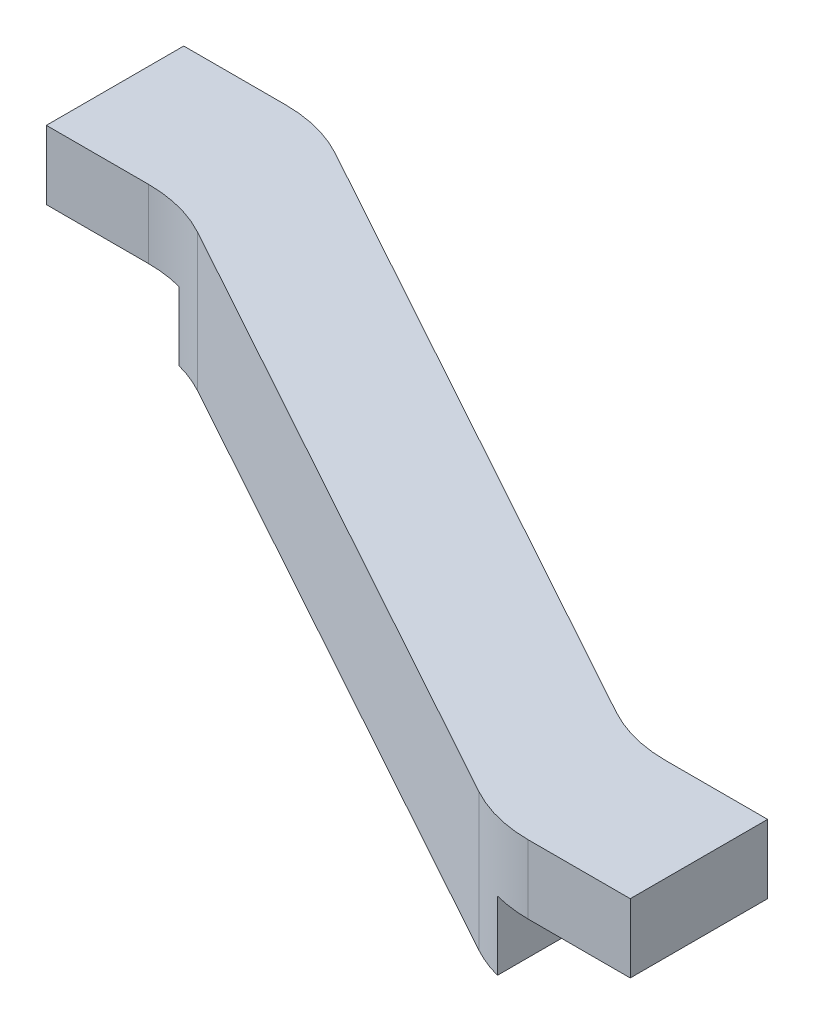
ISO-10303-21;
HEADER;
FILE_DESCRIPTION(('STEP AP214'),'2;1');
FILE_NAME('part.step','',(''),(''),'','','');
FILE_SCHEMA(('AUTOMOTIVE_DESIGN { 1 0 10303 214 1 1 1 1 }'));
ENDSEC;
DATA;
#1=APPLICATION_CONTEXT('core data for automotive mechanical design processes');
#2=APPLICATION_PROTOCOL_DEFINITION('international standard','automotive_design',2000,#1);
#3=PRODUCT_CONTEXT('',#1,'mechanical');
#4=PRODUCT('Part','Part','',(#3));
#5=PRODUCT_RELATED_PRODUCT_CATEGORY('part','',(#4));
#6=PRODUCT_DEFINITION_FORMATION('','',#4);
#7=PRODUCT_DEFINITION_CONTEXT('part definition',#1,'design');
#8=PRODUCT_DEFINITION('design','',#6,#7);
#9=PRODUCT_DEFINITION_SHAPE('','',#8);
#10=(LENGTH_UNIT() NAMED_UNIT(*) SI_UNIT(.MILLI.,.METRE.));
#11=(NAMED_UNIT(*) PLANE_ANGLE_UNIT() SI_UNIT($,.RADIAN.));
#12=(NAMED_UNIT(*) SI_UNIT($,.STERADIAN.) SOLID_ANGLE_UNIT());
#13=UNCERTAINTY_MEASURE_WITH_UNIT(LENGTH_MEASURE(1.E-05),#10,'distance_accuracy_value','');
#14=(GEOMETRIC_REPRESENTATION_CONTEXT(3) GLOBAL_UNCERTAINTY_ASSIGNED_CONTEXT((#13)) GLOBAL_UNIT_ASSIGNED_CONTEXT((#10,
#11,#12)) REPRESENTATION_CONTEXT('',''));
#15=CARTESIAN_POINT('',(0.,0.,0.));
#16=DIRECTION('',(0.,0.,1.));
#17=DIRECTION('',(1.,0.,0.));
#18=AXIS2_PLACEMENT_3D('',#15,#16,#17);
#19=CARTESIAN_POINT('',(-70.,20.,20.));
#20=DIRECTION('',(1.,0.,0.));
#21=DIRECTION('',(0.,0.,-1.));
#22=AXIS2_PLACEMENT_3D('',#19,#20,#21);
#23=PLANE('',#22);
#24=DIRECTION('',(0.,0.,1.));
#25=VECTOR('',#24,1.);
#26=CARTESIAN_POINT('',(-70.,10.,22.7368656040173));
#27=LINE('',#26,#25);
#28=CARTESIAN_POINT('',(-70.,10.,0.));
#29=VERTEX_POINT('',#28);
#30=CARTESIAN_POINT('',(-70.,10.,20.));
#31=VERTEX_POINT('',#30);
#32=EDGE_CURVE('E149',#29,#31,#27,.T.);
#33=ORIENTED_EDGE('',*,*,#32,.T.);
#34=DIRECTION('',(0.,-1.,0.));
#35=VECTOR('',#34,1.);
#36=CARTESIAN_POINT('',(-70.,20.,20.));
#37=LINE('',#36,#35);
#38=CARTESIAN_POINT('',(-70.,20.,20.));
#39=VERTEX_POINT('',#38);
#40=EDGE_CURVE('E188',#39,#31,#37,.T.);
#41=ORIENTED_EDGE('',*,*,#40,.F.);
#42=DIRECTION('',(0.,0.,1.));
#43=VECTOR('',#42,1.);
#44=CARTESIAN_POINT('',(-70.,20.,20.));
#45=LINE('',#44,#43);
#46=CARTESIAN_POINT('',(-70.,20.,0.));
#47=VERTEX_POINT('',#46);
#48=EDGE_CURVE('E173',#47,#39,#45,.T.);
#49=ORIENTED_EDGE('',*,*,#48,.F.);
#50=DIRECTION('',(0.,-1.,0.));
#51=VECTOR('',#50,1.);
#52=CARTESIAN_POINT('',(-70.,20.,0.));
#53=LINE('',#52,#51);
#54=EDGE_CURVE('E167',#47,#29,#53,.T.);
#55=ORIENTED_EDGE('',*,*,#54,.T.);
#56=EDGE_LOOP('',(#33,#41,#49,#55));
#57=FACE_BOUND('',#56,.T.);
#58=ADVANCED_FACE('F39',(#57),#23,.F.);
#59=CARTESIAN_POINT('',(-50.,20.,20.));
#60=DIRECTION('',(0.,0.,-1.));
#61=DIRECTION('',(-1.,0.,0.));
#62=AXIS2_PLACEMENT_3D('',#59,#60,#61);
#63=PLANE('',#62);
#64=DIRECTION('',(-1.,0.,0.));
#65=VECTOR('',#64,1.);
#66=CARTESIAN_POINT('',(-50.,10.,20.));
#67=LINE('',#66,#65);
#68=CARTESIAN_POINT('',(-55.1371353109576,10.,20.));
#69=VERTEX_POINT('',#68);
#70=EDGE_CURVE('E155',#69,#31,#67,.T.);
#71=ORIENTED_EDGE('',*,*,#70,.F.);
#72=DIRECTION('',(0.,-1.,0.));
#73=VECTOR('',#72,1.);
#74=CARTESIAN_POINT('',(-55.1371353109576,20.,20.));
#75=LINE('',#74,#73);
#76=CARTESIAN_POINT('',(-55.1371353109576,20.,20.));
#77=VERTEX_POINT('',#76);
#78=EDGE_CURVE('E214',#69,#77,#75,.F.);
#79=ORIENTED_EDGE('',*,*,#78,.T.);
#80=DIRECTION('',(1.,0.,0.));
#81=VECTOR('',#80,1.);
#82=CARTESIAN_POINT('',(-50.,20.,20.));
#83=LINE('',#82,#81);
#84=EDGE_CURVE('E258',#39,#77,#83,.T.);
#85=ORIENTED_EDGE('',*,*,#84,.F.);
#86=ORIENTED_EDGE('',*,*,#40,.T.);
#87=EDGE_LOOP('',(#71,#79,#85,#86));
#88=FACE_BOUND('',#87,.T.);
#89=ADVANCED_FACE('F322',(#88),#63,.F.);
#90=CARTESIAN_POINT('',(-70.,20.,0.));
#91=DIRECTION('',(0.,0.,1.));
#92=DIRECTION('',(1.,0.,0.));
#93=AXIS2_PLACEMENT_3D('',#90,#91,#92);
#94=PLANE('',#93);
#95=DIRECTION('',(-1.,0.,0.));
#96=VECTOR('',#95,1.);
#97=CARTESIAN_POINT('',(-70.,10.,0.));
#98=LINE('',#97,#96);
#99=CARTESIAN_POINT('',(-55.1371353109576,10.,0.));
#100=VERTEX_POINT('',#99);
#101=EDGE_CURVE('E152',#100,#29,#98,.T.);
#102=ORIENTED_EDGE('',*,*,#101,.T.);
#103=ORIENTED_EDGE('',*,*,#54,.F.);
#104=DIRECTION('',(-1.,0.,0.));
#105=VECTOR('',#104,1.);
#106=CARTESIAN_POINT('',(-70.,20.,0.));
#107=LINE('',#106,#105);
#108=CARTESIAN_POINT('',(-55.1371353109576,20.,0.));
#109=VERTEX_POINT('',#108);
#110=EDGE_CURVE('E175',#109,#47,#107,.T.);
#111=ORIENTED_EDGE('',*,*,#110,.F.);
#112=DIRECTION('',(0.,-1.,0.));
#113=VECTOR('',#112,1.);
#114=CARTESIAN_POINT('',(-55.1371353109576,20.,0.));
#115=LINE('',#114,#113);
#116=EDGE_CURVE('E170',#109,#100,#115,.T.);
#117=ORIENTED_EDGE('',*,*,#116,.T.);
#118=EDGE_LOOP('',(#102,#103,#111,#117));
#119=FACE_BOUND('',#118,.T.);
#120=ADVANCED_FACE('F165',(#119),#94,.F.);
#121=CARTESIAN_POINT('',(0.,0.,0.));
#122=DIRECTION('',(0.,-1.,0.));
#123=DIRECTION('',(0.,0.,-1.));
#124=AXIS2_PLACEMENT_3D('',#121,#122,#123);
#125=PLANE('',#124);
#126=CARTESIAN_POINT('',(-55.1371353109576,0.,40.));
#127=DIRECTION('',(0.,-1.,0.));
#128=DIRECTION('',(0.,0.,-1.));
#129=AXIS2_PLACEMENT_3D('',#126,#127,#128);
#130=CIRCLE('',#129,20.);
#131=CARTESIAN_POINT('',(-45.4987603155144,0.,22.4756818264671));
#132=VERTEX_POINT('',#131);
#133=CARTESIAN_POINT('',(-50.,0.,20.671010352403));
#134=VERTEX_POINT('',#133);
#135=EDGE_CURVE('E221',#132,#134,#130,.F.);
#136=ORIENTED_EDGE('',*,*,#135,.T.);
#137=DIRECTION('',(0.,0.,-1.));
#138=VECTOR('',#137,1.);
#139=CARTESIAN_POINT('',(-50.,0.,0.));
#140=LINE('',#139,#138);
#141=CARTESIAN_POINT('',(-50.,0.,0.671010352402974));
#142=VERTEX_POINT('',#141);
#143=EDGE_CURVE('E160',#134,#142,#140,.T.);
#144=ORIENTED_EDGE('',*,*,#143,.T.);
#145=CARTESIAN_POINT('',(-55.1371353109576,0.,20.));
#146=DIRECTION('',(0.,-1.,0.));
#147=DIRECTION('',(0.,0.,-1.));
#148=AXIS2_PLACEMENT_3D('',#145,#146,#147);
#149=CIRCLE('',#148,20.);
#150=CARTESIAN_POINT('',(-45.4987603155144,0.,2.47568182646706));
#151=VERTEX_POINT('',#150);
#152=EDGE_CURVE('E193',#142,#151,#149,.T.);
#153=ORIENTED_EDGE('',*,*,#152,.T.);
#154=DIRECTION('',(-0.876215908676647,0.,-0.481918749772156));
#155=VECTOR('',#154,1.);
#156=CARTESIAN_POINT('',(-50.,0.,0.));
#157=LINE('',#156,#155);
#158=CARTESIAN_POINT('',(45.4987603155144,0.,52.5243181735329));
#159=VERTEX_POINT('',#158);
#160=EDGE_CURVE('E183',#159,#151,#157,.T.);
#161=ORIENTED_EDGE('',*,*,#160,.F.);
#162=CARTESIAN_POINT('',(55.1371353109575,0.,35.));
#163=DIRECTION('',(0.,-1.,0.));
#164=DIRECTION('',(0.,0.,-1.));
#165=AXIS2_PLACEMENT_3D('',#162,#163,#164);
#166=CIRCLE('',#165,20.);
#167=CARTESIAN_POINT('',(50.,0.,54.3289896475971));
#168=VERTEX_POINT('',#167);
#169=EDGE_CURVE('E216',#159,#168,#166,.F.);
#170=ORIENTED_EDGE('',*,*,#169,.T.);
#171=DIRECTION('',(0.,0.,1.));
#172=VECTOR('',#171,1.);
#173=CARTESIAN_POINT('',(50.,0.,52.5478681675662));
#174=LINE('',#173,#172);
#175=CARTESIAN_POINT('',(50.,0.,74.328989647597));
#176=VERTEX_POINT('',#175);
#177=EDGE_CURVE('E291',#168,#176,#174,.T.);
#178=ORIENTED_EDGE('',*,*,#177,.T.);
#179=CARTESIAN_POINT('',(55.1371353109575,0.,55.));
#180=DIRECTION('',(0.,-1.,0.));
#181=DIRECTION('',(0.,0.,-1.));
#182=AXIS2_PLACEMENT_3D('',#179,#180,#181);
#183=CIRCLE('',#182,20.);
#184=CARTESIAN_POINT('',(45.4987603155144,0.,72.5243181735329));
#185=VERTEX_POINT('',#184);
#186=EDGE_CURVE('E195',#176,#185,#183,.T.);
#187=ORIENTED_EDGE('',*,*,#186,.T.);
#188=DIRECTION('',(0.876215908676647,0.,0.481918749772156));
#189=VECTOR('',#188,1.);
#190=CARTESIAN_POINT('',(50.,0.,75.));
#191=LINE('',#190,#189);
#192=EDGE_CURVE('E256',#132,#185,#191,.T.);
#193=ORIENTED_EDGE('',*,*,#192,.F.);
#194=EDGE_LOOP('',(#136,#144,#153,#161,#170,#178,#187,#193));
#195=FACE_BOUND('',#194,.T.);
#196=ADVANCED_FACE('F290',(#195),#125,.T.);
#197=CARTESIAN_POINT('',(55.1371353109575,20.,55.));
#198=DIRECTION('',(0.,-1.,0.));
#199=DIRECTION('',(0.,0.,-1.));
#200=AXIS2_PLACEMENT_3D('',#197,#198,#199);
#201=CYLINDRICAL_SURFACE('',#200,20.);
#202=ORIENTED_EDGE('',*,*,#186,.F.);
#203=DIRECTION('',(0.,-1.,0.));
#204=VECTOR('',#203,1.);
#205=CARTESIAN_POINT('',(50.,20.,74.328989647597));
#206=LINE('',#205,#204);
#207=CARTESIAN_POINT('',(50.,10.,74.328989647597));
#208=VERTEX_POINT('',#207);
#209=EDGE_CURVE('E247',#176,#208,#206,.F.);
#210=ORIENTED_EDGE('',*,*,#209,.T.);
#211=CARTESIAN_POINT('',(55.1371353109575,10.,55.));
#212=DIRECTION('',(0.,1.,0.));
#213=DIRECTION('',(0.,0.,1.));
#214=AXIS2_PLACEMENT_3D('',#211,#212,#213);
#215=CIRCLE('',#214,20.);
#216=CARTESIAN_POINT('',(55.1371353109575,10.,75.));
#217=VERTEX_POINT('',#216);
#218=EDGE_CURVE('E244',#217,#208,#215,.F.);
#219=ORIENTED_EDGE('',*,*,#218,.F.);
#220=DIRECTION('',(0.,-1.,0.));
#221=VECTOR('',#220,1.);
#222=CARTESIAN_POINT('',(55.1371353109575,20.,75.));
#223=LINE('',#222,#221);
#224=CARTESIAN_POINT('',(55.1371353109575,20.,75.));
#225=VERTEX_POINT('',#224);
#226=EDGE_CURVE('E190',#225,#217,#223,.T.);
#227=ORIENTED_EDGE('',*,*,#226,.F.);
#228=CARTESIAN_POINT('',(55.1371353109575,20.,55.));
#229=DIRECTION('',(0.,-1.,0.));
#230=DIRECTION('',(0.,0.,-1.));
#231=AXIS2_PLACEMENT_3D('',#228,#229,#230);
#232=CIRCLE('',#231,20.);
#233=CARTESIAN_POINT('',(45.4987603155144,20.,72.5243181735329));
#234=VERTEX_POINT('',#233);
#235=EDGE_CURVE('E204',#234,#225,#232,.F.);
#236=ORIENTED_EDGE('',*,*,#235,.F.);
#237=DIRECTION('',(0.,-1.,0.));
#238=VECTOR('',#237,1.);
#239=CARTESIAN_POINT('',(45.4987603155144,20.,72.5243181735329));
#240=LINE('',#239,#238);
#241=EDGE_CURVE('E200',#185,#234,#240,.F.);
#242=ORIENTED_EDGE('',*,*,#241,.F.);
#243=EDGE_LOOP('',(#202,#210,#219,#227,#236,#242));
#244=FACE_BOUND('',#243,.T.);
#245=ADVANCED_FACE('F297',(#244),#201,.T.);
#246=CARTESIAN_POINT('',(55.1371353109575,20.,35.));
#247=DIRECTION('',(0.,1.,0.));
#248=DIRECTION('',(0.,0.,1.));
#249=AXIS2_PLACEMENT_3D('',#246,#247,#248);
#250=CYLINDRICAL_SURFACE('',#249,20.);
#251=DIRECTION('',(0.,1.,0.));
#252=VECTOR('',#251,1.);
#253=CARTESIAN_POINT('',(50.,20.,54.328989647597));
#254=LINE('',#253,#252);
#255=CARTESIAN_POINT('',(50.,10.,54.3289896475971));
#256=VERTEX_POINT('',#255);
#257=EDGE_CURVE('E11',#168,#256,#254,.T.);
#258=ORIENTED_EDGE('',*,*,#257,.F.);
#259=ORIENTED_EDGE('',*,*,#169,.F.);
#260=DIRECTION('',(0.,-1.,0.));
#261=VECTOR('',#260,1.);
#262=CARTESIAN_POINT('',(45.4987603155144,0.,52.524318173533));
#263=LINE('',#262,#261);
#264=CARTESIAN_POINT('',(45.4987603155144,20.,52.5243181735329));
#265=VERTEX_POINT('',#264);
#266=EDGE_CURVE('E208',#265,#159,#263,.T.);
#267=ORIENTED_EDGE('',*,*,#266,.F.);
#268=CARTESIAN_POINT('',(55.1371353109575,20.,35.));
#269=DIRECTION('',(0.,-1.,0.));
#270=DIRECTION('',(0.,0.,-1.));
#271=AXIS2_PLACEMENT_3D('',#268,#269,#270);
#272=CIRCLE('',#271,20.);
#273=CARTESIAN_POINT('',(55.1371353109575,20.,55.));
#274=VERTEX_POINT('',#273);
#275=EDGE_CURVE('E219',#274,#265,#272,.T.);
#276=ORIENTED_EDGE('',*,*,#275,.F.);
#277=DIRECTION('',(0.,-1.,0.));
#278=VECTOR('',#277,1.);
#279=CARTESIAN_POINT('',(55.1371353109575,20.,55.));
#280=LINE('',#279,#278);
#281=CARTESIAN_POINT('',(55.1371353109575,10.,55.));
#282=VERTEX_POINT('',#281);
#283=EDGE_CURVE('E211',#282,#274,#280,.F.);
#284=ORIENTED_EDGE('',*,*,#283,.F.);
#285=CARTESIAN_POINT('',(55.1371353109575,10.,35.));
#286=DIRECTION('',(0.,1.,0.));
#287=DIRECTION('',(0.,0.,1.));
#288=AXIS2_PLACEMENT_3D('',#285,#286,#287);
#289=CIRCLE('',#288,20.);
#290=EDGE_CURVE('E47',#282,#256,#289,.F.);
#291=ORIENTED_EDGE('',*,*,#290,.T.);
#292=EDGE_LOOP('',(#258,#259,#267,#276,#284,#291));
#293=FACE_BOUND('',#292,.T.);
#294=ADVANCED_FACE('F233',(#293),#250,.F.);
#295=CARTESIAN_POINT('',(-55.1371353109576,20.,20.));
#296=DIRECTION('',(0.,-1.,0.));
#297=DIRECTION('',(0.,0.,-1.));
#298=AXIS2_PLACEMENT_3D('',#295,#296,#297);
#299=CYLINDRICAL_SURFACE('',#298,20.);
#300=ORIENTED_EDGE('',*,*,#152,.F.);
#301=DIRECTION('',(0.,-1.,0.));
#302=VECTOR('',#301,1.);
#303=CARTESIAN_POINT('',(-50.,20.,0.671010352402978));
#304=LINE('',#303,#302);
#305=CARTESIAN_POINT('',(-50.,10.,0.671010352402974));
#306=VERTEX_POINT('',#305);
#307=EDGE_CURVE('E245',#142,#306,#304,.F.);
#308=ORIENTED_EDGE('',*,*,#307,.T.);
#309=CARTESIAN_POINT('',(-55.1371353109576,10.,20.));
#310=DIRECTION('',(0.,-1.,0.));
#311=DIRECTION('',(0.,0.,-1.));
#312=AXIS2_PLACEMENT_3D('',#309,#310,#311);
#313=CIRCLE('',#312,20.);
#314=EDGE_CURVE('E250',#306,#100,#313,.F.);
#315=ORIENTED_EDGE('',*,*,#314,.T.);
#316=ORIENTED_EDGE('',*,*,#116,.F.);
#317=CARTESIAN_POINT('',(-55.1371353109576,20.,20.));
#318=DIRECTION('',(0.,-1.,0.));
#319=DIRECTION('',(0.,0.,-1.));
#320=AXIS2_PLACEMENT_3D('',#317,#318,#319);
#321=CIRCLE('',#320,20.);
#322=CARTESIAN_POINT('',(-45.4987603155144,20.,2.47568182646706));
#323=VERTEX_POINT('',#322);
#324=EDGE_CURVE('E202',#323,#109,#321,.F.);
#325=ORIENTED_EDGE('',*,*,#324,.F.);
#326=DIRECTION('',(0.,-1.,0.));
#327=VECTOR('',#326,1.);
#328=CARTESIAN_POINT('',(-45.4987603155144,20.,2.47568182646706));
#329=LINE('',#328,#327);
#330=EDGE_CURVE('E206',#151,#323,#329,.F.);
#331=ORIENTED_EDGE('',*,*,#330,.F.);
#332=EDGE_LOOP('',(#300,#308,#315,#316,#325,#331));
#333=FACE_BOUND('',#332,.T.);
#334=ADVANCED_FACE('F286',(#333),#299,.T.);
#335=CARTESIAN_POINT('',(-55.1371353109576,20.,40.));
#336=DIRECTION('',(0.,1.,0.));
#337=DIRECTION('',(0.,0.,1.));
#338=AXIS2_PLACEMENT_3D('',#335,#336,#337);
#339=CYLINDRICAL_SURFACE('',#338,20.);
#340=DIRECTION('',(0.,1.,0.));
#341=VECTOR('',#340,1.);
#342=CARTESIAN_POINT('',(-50.,20.,20.671010352403));
#343=LINE('',#342,#341);
#344=CARTESIAN_POINT('',(-50.,10.,20.671010352403));
#345=VERTEX_POINT('',#344);
#346=EDGE_CURVE('E228',#134,#345,#343,.T.);
#347=ORIENTED_EDGE('',*,*,#346,.F.);
#348=ORIENTED_EDGE('',*,*,#135,.F.);
#349=DIRECTION('',(0.,-1.,0.));
#350=VECTOR('',#349,1.);
#351=CARTESIAN_POINT('',(-45.4987603155145,0.,22.475681826467));
#352=LINE('',#351,#350);
#353=CARTESIAN_POINT('',(-45.4987603155144,20.,22.4756818264671));
#354=VERTEX_POINT('',#353);
#355=EDGE_CURVE('E197',#354,#132,#352,.T.);
#356=ORIENTED_EDGE('',*,*,#355,.F.);
#357=CARTESIAN_POINT('',(-55.1371353109576,20.,40.));
#358=DIRECTION('',(0.,-1.,0.));
#359=DIRECTION('',(0.,0.,-1.));
#360=AXIS2_PLACEMENT_3D('',#357,#358,#359);
#361=CIRCLE('',#360,20.);
#362=EDGE_CURVE('E224',#77,#354,#361,.T.);
#363=ORIENTED_EDGE('',*,*,#362,.F.);
#364=ORIENTED_EDGE('',*,*,#78,.F.);
#365=CARTESIAN_POINT('',(-55.1371353109576,10.,40.));
#366=DIRECTION('',(0.,-1.,0.));
#367=DIRECTION('',(0.,0.,-1.));
#368=AXIS2_PLACEMENT_3D('',#365,#366,#367);
#369=CIRCLE('',#368,20.);
#370=EDGE_CURVE('E226',#345,#69,#369,.F.);
#371=ORIENTED_EDGE('',*,*,#370,.F.);
#372=EDGE_LOOP('',(#347,#348,#356,#363,#364,#371));
#373=FACE_BOUND('',#372,.T.);
#374=ADVANCED_FACE('F41',(#373),#339,.F.);
#375=CARTESIAN_POINT('',(50.,20.,75.));
#376=DIRECTION('',(0.481918749772156,0.,-0.876215908676647));
#377=DIRECTION('',(-0.876215908676647,0.,-0.481918749772156));
#378=AXIS2_PLACEMENT_3D('',#375,#376,#377);
#379=PLANE('',#378);
#380=ORIENTED_EDGE('',*,*,#192,.T.);
#381=ORIENTED_EDGE('',*,*,#241,.T.);
#382=DIRECTION('',(0.876215908676647,0.,0.481918749772156));
#383=VECTOR('',#382,1.);
#384=CARTESIAN_POINT('',(50.,20.,75.));
#385=LINE('',#384,#383);
#386=EDGE_CURVE('E261',#354,#234,#385,.T.);
#387=ORIENTED_EDGE('',*,*,#386,.F.);
#388=ORIENTED_EDGE('',*,*,#355,.T.);
#389=EDGE_LOOP('',(#380,#381,#387,#388));
#390=FACE_BOUND('',#389,.T.);
#391=ADVANCED_FACE('F302',(#390),#379,.F.);
#392=CARTESIAN_POINT('',(70.,20.,75.));
#393=DIRECTION('',(0.,0.,-1.));
#394=DIRECTION('',(-1.,0.,0.));
#395=AXIS2_PLACEMENT_3D('',#392,#393,#394);
#396=PLANE('',#395);
#397=ORIENTED_EDGE('',*,*,#226,.T.);
#398=DIRECTION('',(1.,0.,0.));
#399=VECTOR('',#398,1.);
#400=CARTESIAN_POINT('',(50.,10.,75.));
#401=LINE('',#400,#399);
#402=CARTESIAN_POINT('',(70.,10.,75.));
#403=VERTEX_POINT('',#402);
#404=EDGE_CURVE('E315',#217,#403,#401,.T.);
#405=ORIENTED_EDGE('',*,*,#404,.T.);
#406=DIRECTION('',(0.,-1.,0.));
#407=VECTOR('',#406,1.);
#408=CARTESIAN_POINT('',(70.,20.,75.));
#409=LINE('',#408,#407);
#410=CARTESIAN_POINT('',(70.,20.,75.));
#411=VERTEX_POINT('',#410);
#412=EDGE_CURVE('E178',#411,#403,#409,.T.);
#413=ORIENTED_EDGE('',*,*,#412,.F.);
#414=DIRECTION('',(1.,0.,0.));
#415=VECTOR('',#414,1.);
#416=CARTESIAN_POINT('',(70.,20.,75.));
#417=LINE('',#416,#415);
#418=EDGE_CURVE('E264',#225,#411,#417,.T.);
#419=ORIENTED_EDGE('',*,*,#418,.F.);
#420=EDGE_LOOP('',(#397,#405,#413,#419));
#421=FACE_BOUND('',#420,.T.);
#422=ADVANCED_FACE('F345',(#421),#396,.F.);
#423=CARTESIAN_POINT('',(70.,20.,55.));
#424=DIRECTION('',(-1.,0.,0.));
#425=DIRECTION('',(0.,0.,1.));
#426=AXIS2_PLACEMENT_3D('',#423,#424,#425);
#427=PLANE('',#426);
#428=ORIENTED_EDGE('',*,*,#412,.T.);
#429=DIRECTION('',(0.,0.,-1.));
#430=VECTOR('',#429,1.);
#431=CARTESIAN_POINT('',(70.,10.,75.));
#432=LINE('',#431,#430);
#433=CARTESIAN_POINT('',(70.,10.,55.));
#434=VERTEX_POINT('',#433);
#435=EDGE_CURVE('E294',#403,#434,#432,.T.);
#436=ORIENTED_EDGE('',*,*,#435,.T.);
#437=DIRECTION('',(0.,-1.,0.));
#438=VECTOR('',#437,1.);
#439=CARTESIAN_POINT('',(70.,20.,55.));
#440=LINE('',#439,#438);
#441=CARTESIAN_POINT('',(70.,20.,55.));
#442=VERTEX_POINT('',#441);
#443=EDGE_CURVE('E174',#442,#434,#440,.T.);
#444=ORIENTED_EDGE('',*,*,#443,.F.);
#445=DIRECTION('',(0.,0.,-1.));
#446=VECTOR('',#445,1.);
#447=CARTESIAN_POINT('',(70.,20.,55.));
#448=LINE('',#447,#446);
#449=EDGE_CURVE('E266',#411,#442,#448,.T.);
#450=ORIENTED_EDGE('',*,*,#449,.F.);
#451=EDGE_LOOP('',(#428,#436,#444,#450));
#452=FACE_BOUND('',#451,.T.);
#453=ADVANCED_FACE('F349',(#452),#427,.F.);
#454=CARTESIAN_POINT('',(50.,20.,55.));
#455=DIRECTION('',(0.,0.,1.));
#456=DIRECTION('',(1.,0.,0.));
#457=AXIS2_PLACEMENT_3D('',#454,#455,#456);
#458=PLANE('',#457);
#459=ORIENTED_EDGE('',*,*,#443,.T.);
#460=DIRECTION('',(-1.,0.,0.));
#461=VECTOR('',#460,1.);
#462=CARTESIAN_POINT('',(50.,10.,55.));
#463=LINE('',#462,#461);
#464=EDGE_CURVE('E237',#434,#282,#463,.T.);
#465=ORIENTED_EDGE('',*,*,#464,.T.);
#466=ORIENTED_EDGE('',*,*,#283,.T.);
#467=DIRECTION('',(-1.,0.,0.));
#468=VECTOR('',#467,1.);
#469=CARTESIAN_POINT('',(50.,20.,55.));
#470=LINE('',#469,#468);
#471=EDGE_CURVE('E268',#442,#274,#470,.T.);
#472=ORIENTED_EDGE('',*,*,#471,.F.);
#473=EDGE_LOOP('',(#459,#465,#466,#472));
#474=FACE_BOUND('',#473,.T.);
#475=ADVANCED_FACE('F240',(#474),#458,.F.);
#476=CARTESIAN_POINT('',(-50.,20.,0.));
#477=DIRECTION('',(-0.481918749772156,0.,0.876215908676647));
#478=DIRECTION('',(0.876215908676647,0.,0.481918749772156));
#479=AXIS2_PLACEMENT_3D('',#476,#477,#478);
#480=PLANE('',#479);
#481=DIRECTION('',(-0.876215908676647,0.,-0.481918749772156));
#482=VECTOR('',#481,1.);
#483=CARTESIAN_POINT('',(-50.,20.,0.));
#484=LINE('',#483,#482);
#485=EDGE_CURVE('E180',#265,#323,#484,.T.);
#486=ORIENTED_EDGE('',*,*,#485,.F.);
#487=ORIENTED_EDGE('',*,*,#266,.T.);
#488=ORIENTED_EDGE('',*,*,#160,.T.);
#489=ORIENTED_EDGE('',*,*,#330,.T.);
#490=EDGE_LOOP('',(#486,#487,#488,#489));
#491=FACE_BOUND('',#490,.T.);
#492=ADVANCED_FACE('F280',(#491),#480,.F.);
#493=CARTESIAN_POINT('',(0.,20.,0.));
#494=DIRECTION('',(0.,-1.,0.));
#495=DIRECTION('',(0.,0.,-1.));
#496=AXIS2_PLACEMENT_3D('',#493,#494,#495);
#497=PLANE('',#496);
#498=ORIENTED_EDGE('',*,*,#386,.T.);
#499=ORIENTED_EDGE('',*,*,#235,.T.);
#500=ORIENTED_EDGE('',*,*,#418,.T.);
#501=ORIENTED_EDGE('',*,*,#449,.T.);
#502=ORIENTED_EDGE('',*,*,#471,.T.);
#503=ORIENTED_EDGE('',*,*,#275,.T.);
#504=ORIENTED_EDGE('',*,*,#485,.T.);
#505=ORIENTED_EDGE('',*,*,#324,.T.);
#506=ORIENTED_EDGE('',*,*,#110,.T.);
#507=ORIENTED_EDGE('',*,*,#48,.T.);
#508=ORIENTED_EDGE('',*,*,#84,.T.);
#509=ORIENTED_EDGE('',*,*,#362,.T.);
#510=EDGE_LOOP('',(#498,#499,#500,#501,#502,#503,#504,#505,#506,#507,#508,#509));
#511=FACE_BOUND('',#510,.T.);
#512=ADVANCED_FACE('F288',(#511),#497,.F.);
#513=CARTESIAN_POINT('',(-50.,10.,0.));
#514=DIRECTION('',(-1.,0.,0.));
#515=DIRECTION('',(0.,0.,1.));
#516=AXIS2_PLACEMENT_3D('',#513,#514,#515);
#517=PLANE('',#516);
#518=ORIENTED_EDGE('',*,*,#143,.F.);
#519=ORIENTED_EDGE('',*,*,#346,.T.);
#520=DIRECTION('',(0.,0.,-1.));
#521=VECTOR('',#520,1.);
#522=CARTESIAN_POINT('',(-50.,10.,0.));
#523=LINE('',#522,#521);
#524=EDGE_CURVE('E61',#345,#306,#523,.T.);
#525=ORIENTED_EDGE('',*,*,#524,.T.);
#526=ORIENTED_EDGE('',*,*,#307,.F.);
#527=EDGE_LOOP('',(#518,#519,#525,#526));
#528=FACE_BOUND('',#527,.T.);
#529=ADVANCED_FACE('F320',(#528),#517,.T.);
#530=CARTESIAN_POINT('',(0.,10.,0.));
#531=DIRECTION('',(0.,-1.,0.));
#532=DIRECTION('',(0.,0.,-1.));
#533=AXIS2_PLACEMENT_3D('',#530,#531,#532);
#534=PLANE('',#533);
#535=ORIENTED_EDGE('',*,*,#524,.F.);
#536=ORIENTED_EDGE('',*,*,#370,.T.);
#537=ORIENTED_EDGE('',*,*,#70,.T.);
#538=ORIENTED_EDGE('',*,*,#32,.F.);
#539=ORIENTED_EDGE('',*,*,#101,.F.);
#540=ORIENTED_EDGE('',*,*,#314,.F.);
#541=EDGE_LOOP('',(#535,#536,#537,#538,#539,#540));
#542=FACE_BOUND('',#541,.T.);
#543=ADVANCED_FACE('F151',(#542),#534,.T.);
#544=CARTESIAN_POINT('',(50.,10.,52.5478681675662));
#545=DIRECTION('',(1.,0.,0.));
#546=DIRECTION('',(0.,0.,-1.));
#547=AXIS2_PLACEMENT_3D('',#544,#545,#546);
#548=PLANE('',#547);
#549=ORIENTED_EDGE('',*,*,#177,.F.);
#550=ORIENTED_EDGE('',*,*,#257,.T.);
#551=DIRECTION('',(0.,0.,1.));
#552=VECTOR('',#551,1.);
#553=CARTESIAN_POINT('',(50.,10.,52.5478681675662));
#554=LINE('',#553,#552);
#555=EDGE_CURVE('E54',#256,#208,#554,.T.);
#556=ORIENTED_EDGE('',*,*,#555,.T.);
#557=ORIENTED_EDGE('',*,*,#209,.F.);
#558=EDGE_LOOP('',(#549,#550,#556,#557));
#559=FACE_BOUND('',#558,.T.);
#560=ADVANCED_FACE('F366',(#559),#548,.T.);
#561=CARTESIAN_POINT('',(0.,10.,0.));
#562=DIRECTION('',(0.,1.,0.));
#563=DIRECTION('',(0.,0.,1.));
#564=AXIS2_PLACEMENT_3D('',#561,#562,#563);
#565=PLANE('',#564);
#566=ORIENTED_EDGE('',*,*,#218,.T.);
#567=ORIENTED_EDGE('',*,*,#555,.F.);
#568=ORIENTED_EDGE('',*,*,#290,.F.);
#569=ORIENTED_EDGE('',*,*,#464,.F.);
#570=ORIENTED_EDGE('',*,*,#435,.F.);
#571=ORIENTED_EDGE('',*,*,#404,.F.);
#572=EDGE_LOOP('',(#566,#567,#568,#569,#570,#571));
#573=FACE_BOUND('',#572,.T.);
#574=ADVANCED_FACE('F236',(#573),#565,.F.);
#575=CLOSED_SHELL('',(#58,#89,#120,#196,#245,#294,#334,#374,#391,#422,#453,#475,#492,#512,#529,
#543,#560,#574));
#576=MANIFOLD_SOLID_BREP('B2',#575);
#577=ADVANCED_BREP_SHAPE_REPRESENTATION('',(#18,#576),#14);
#578=SHAPE_DEFINITION_REPRESENTATION(#9,#577);
ENDSEC;
END-ISO-10303-21;
